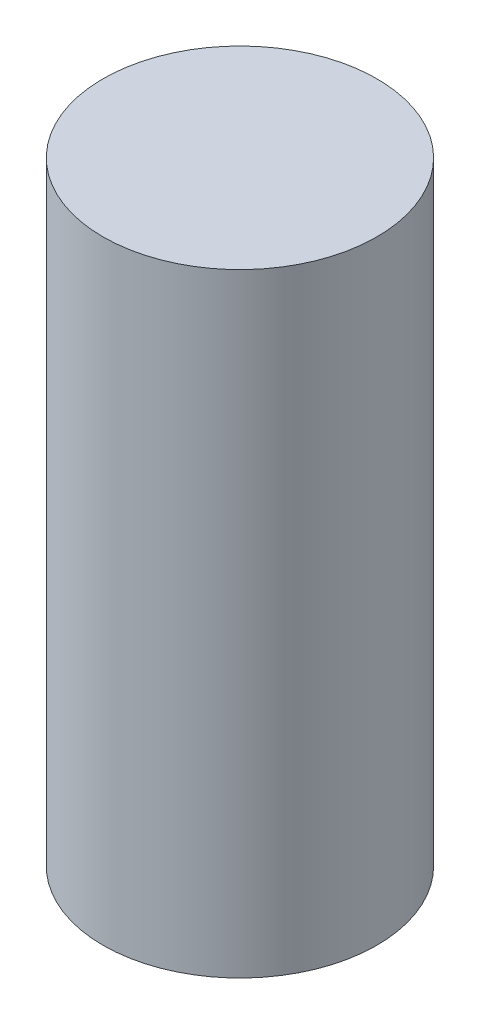
ISO-10303-21;
HEADER;
FILE_DESCRIPTION(('STEP AP214'),'2;1');
FILE_NAME('part.step','',(''),(''),'','','');
FILE_SCHEMA(('AUTOMOTIVE_DESIGN { 1 0 10303 214 1 1 1 1 }'));
ENDSEC;
DATA;
#1=APPLICATION_CONTEXT('core data for automotive mechanical design processes');
#2=APPLICATION_PROTOCOL_DEFINITION('international standard','automotive_design',2000,#1);
#3=PRODUCT_CONTEXT('',#1,'mechanical');
#4=PRODUCT('Part','Part','',(#3));
#5=PRODUCT_RELATED_PRODUCT_CATEGORY('part','',(#4));
#6=PRODUCT_DEFINITION_FORMATION('','',#4);
#7=PRODUCT_DEFINITION_CONTEXT('part definition',#1,'design');
#8=PRODUCT_DEFINITION('design','',#6,#7);
#9=PRODUCT_DEFINITION_SHAPE('','',#8);
#10=(LENGTH_UNIT() NAMED_UNIT(*) SI_UNIT(.MILLI.,.METRE.));
#11=(NAMED_UNIT(*) PLANE_ANGLE_UNIT() SI_UNIT($,.RADIAN.));
#12=(NAMED_UNIT(*) SI_UNIT($,.STERADIAN.) SOLID_ANGLE_UNIT());
#13=UNCERTAINTY_MEASURE_WITH_UNIT(LENGTH_MEASURE(1.E-05),#10,'distance_accuracy_value','');
#14=(GEOMETRIC_REPRESENTATION_CONTEXT(3) GLOBAL_UNCERTAINTY_ASSIGNED_CONTEXT((#13)) GLOBAL_UNIT_ASSIGNED_CONTEXT((#10,
#11,#12)) REPRESENTATION_CONTEXT('',''));
#15=CARTESIAN_POINT('',(0.,0.,0.));
#16=DIRECTION('',(0.,0.,1.));
#17=DIRECTION('',(1.,0.,0.));
#18=AXIS2_PLACEMENT_3D('',#15,#16,#17);
#19=CARTESIAN_POINT('',(0.,140.,0.));
#20=DIRECTION('',(0.,-1.,0.));
#21=DIRECTION('',(0.,0.,-1.));
#22=AXIS2_PLACEMENT_3D('',#19,#20,#21);
#23=CYLINDRICAL_SURFACE('',#22,31.25);
#24=CARTESIAN_POINT('',(0.,140.,0.));
#25=DIRECTION('',(0.,1.,0.));
#26=DIRECTION('',(0.,0.,1.));
#27=AXIS2_PLACEMENT_3D('',#24,#25,#26);
#28=CIRCLE('',#27,31.25);
#29=CARTESIAN_POINT('',(0.,140.,31.25));
#30=VERTEX_POINT('',#29);
#31=EDGE_CURVE('E10',#30,#30,#28,.T.);
#32=ORIENTED_EDGE('',*,*,#31,.F.);
#33=EDGE_LOOP('',(#32));
#34=FACE_BOUND('',#33,.T.);
#35=CARTESIAN_POINT('',(0.,0.,0.));
#36=DIRECTION('',(0.,1.,0.));
#37=DIRECTION('',(0.,0.,1.));
#38=AXIS2_PLACEMENT_3D('',#35,#36,#37);
#39=CIRCLE('',#38,31.25);
#40=CARTESIAN_POINT('',(0.,0.,31.25));
#41=VERTEX_POINT('',#40);
#42=EDGE_CURVE('E34',#41,#41,#39,.T.);
#43=ORIENTED_EDGE('',*,*,#42,.T.);
#44=EDGE_LOOP('',(#43));
#45=FACE_BOUND('',#44,.T.);
#46=ADVANCED_FACE('F31',(#34,#45),#23,.T.);
#47=CARTESIAN_POINT('',(0.,140.,0.));
#48=DIRECTION('',(0.,1.,0.));
#49=DIRECTION('',(0.,0.,1.));
#50=AXIS2_PLACEMENT_3D('',#47,#48,#49);
#51=PLANE('',#50);
#52=ORIENTED_EDGE('',*,*,#31,.T.);
#53=EDGE_LOOP('',(#52));
#54=FACE_BOUND('',#53,.T.);
#55=ADVANCED_FACE('F46',(#54),#51,.T.);
#56=CARTESIAN_POINT('',(0.,0.,0.));
#57=DIRECTION('',(0.,1.,0.));
#58=DIRECTION('',(0.,0.,1.));
#59=AXIS2_PLACEMENT_3D('',#56,#57,#58);
#60=PLANE('',#59);
#61=ORIENTED_EDGE('',*,*,#42,.F.);
#62=EDGE_LOOP('',(#61));
#63=FACE_BOUND('',#62,.T.);
#64=ADVANCED_FACE('F44',(#63),#60,.F.);
#65=CLOSED_SHELL('',(#46,#55,#64));
#66=MANIFOLD_SOLID_BREP('B2',#65);
#67=ADVANCED_BREP_SHAPE_REPRESENTATION('',(#18,#66),#14);
#68=SHAPE_DEFINITION_REPRESENTATION(#9,#67);
ENDSEC;
END-ISO-10303-21;
